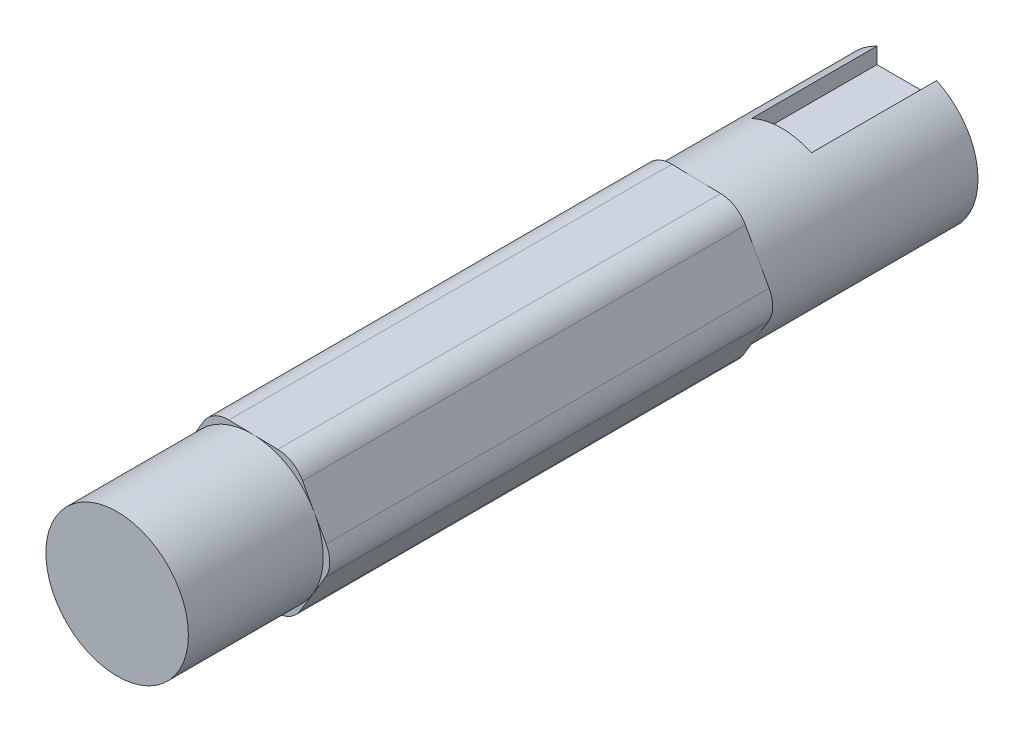
ISO-10303-21;
HEADER;
FILE_DESCRIPTION(('STEP AP214'),'2;1');
FILE_NAME('part.step','',(''),(''),'','','');
FILE_SCHEMA(('AUTOMOTIVE_DESIGN { 1 0 10303 214 1 1 1 1 }'));
ENDSEC;
DATA;
#1=APPLICATION_CONTEXT('core data for automotive mechanical design processes');
#2=APPLICATION_PROTOCOL_DEFINITION('international standard','automotive_design',2000,#1);
#3=PRODUCT_CONTEXT('',#1,'mechanical');
#4=PRODUCT('Part','Part','',(#3));
#5=PRODUCT_RELATED_PRODUCT_CATEGORY('part','',(#4));
#6=PRODUCT_DEFINITION_FORMATION('','',#4);
#7=PRODUCT_DEFINITION_CONTEXT('part definition',#1,'design');
#8=PRODUCT_DEFINITION('design','',#6,#7);
#9=PRODUCT_DEFINITION_SHAPE('','',#8);
#10=(LENGTH_UNIT() NAMED_UNIT(*) SI_UNIT(.MILLI.,.METRE.));
#11=(NAMED_UNIT(*) PLANE_ANGLE_UNIT() SI_UNIT($,.RADIAN.));
#12=(NAMED_UNIT(*) SI_UNIT($,.STERADIAN.) SOLID_ANGLE_UNIT());
#13=UNCERTAINTY_MEASURE_WITH_UNIT(LENGTH_MEASURE(1.E-05),#10,'distance_accuracy_value','');
#14=(GEOMETRIC_REPRESENTATION_CONTEXT(3) GLOBAL_UNCERTAINTY_ASSIGNED_CONTEXT((#13)) GLOBAL_UNIT_ASSIGNED_CONTEXT((#10,
#11,#12)) REPRESENTATION_CONTEXT('',''));
#15=CARTESIAN_POINT('',(0.,0.,0.));
#16=DIRECTION('',(0.,0.,1.));
#17=DIRECTION('',(1.,0.,0.));
#18=AXIS2_PLACEMENT_3D('',#15,#16,#17);
#19=CARTESIAN_POINT('',(0.,0.,-45.));
#20=DIRECTION('',(0.,0.,1.));
#21=DIRECTION('',(1.,0.,0.));
#22=AXIS2_PLACEMENT_3D('',#19,#20,#21);
#23=CYLINDRICAL_SURFACE('',#22,7.4);
#24=DIRECTION('',(0.,0.,1.));
#25=VECTOR('',#24,1.);
#26=CARTESIAN_POINT('',(3.1,6.71937497093294,-45.));
#27=LINE('',#26,#25);
#28=CARTESIAN_POINT('',(3.1,6.71937497093294,-32.));
#29=VERTEX_POINT('',#28);
#30=CARTESIAN_POINT('',(3.1,6.71937497093294,-45.));
#31=VERTEX_POINT('',#30);
#32=EDGE_CURVE('E268',#29,#31,#27,.F.);
#33=ORIENTED_EDGE('',*,*,#32,.F.);
#34=CARTESIAN_POINT('',(0.,0.,-32.));
#35=DIRECTION('',(0.,0.,-1.));
#36=DIRECTION('',(-1.,0.,0.));
#37=AXIS2_PLACEMENT_3D('',#34,#35,#36);
#38=CIRCLE('',#37,7.4);
#39=CARTESIAN_POINT('',(-3.1,6.71937497093294,-32.));
#40=VERTEX_POINT('',#39);
#41=EDGE_CURVE('E228',#29,#40,#38,.F.);
#42=ORIENTED_EDGE('',*,*,#41,.T.);
#43=DIRECTION('',(0.,0.,1.));
#44=VECTOR('',#43,1.);
#45=CARTESIAN_POINT('',(-3.1,6.71937497093294,-45.));
#46=LINE('',#45,#44);
#47=CARTESIAN_POINT('',(-3.1,6.71937497093294,-45.));
#48=VERTEX_POINT('',#47);
#49=EDGE_CURVE('E263',#48,#40,#46,.T.);
#50=ORIENTED_EDGE('',*,*,#49,.F.);
#51=CARTESIAN_POINT('',(0.,0.,-45.));
#52=DIRECTION('',(0.,0.,1.));
#53=DIRECTION('',(1.,0.,0.));
#54=AXIS2_PLACEMENT_3D('',#51,#52,#53);
#55=CIRCLE('',#54,7.4);
#56=EDGE_CURVE('E275',#48,#31,#55,.T.);
#57=ORIENTED_EDGE('',*,*,#56,.T.);
#58=EDGE_LOOP('',(#33,#42,#50,#57));
#59=FACE_BOUND('',#58,.T.);
#60=CARTESIAN_POINT('',(0.,0.,-23.));
#61=DIRECTION('',(0.,0.,1.));
#62=DIRECTION('',(1.,0.,0.));
#63=AXIS2_PLACEMENT_3D('',#60,#61,#62);
#64=CIRCLE('',#63,7.4);
#65=CARTESIAN_POINT('',(6.48141034826039,3.57089903210146,-23.));
#66=VERTEX_POINT('',#65);
#67=CARTESIAN_POINT('',(6.33319445027932,-3.82761649789412,-23.));
#68=VERTEX_POINT('',#67);
#69=EDGE_CURVE('E218',#66,#68,#64,.F.);
#70=ORIENTED_EDGE('',*,*,#69,.T.);
#71=CARTESIAN_POINT('',(-0.148215897981072,-7.39851552999558,-23.));
#72=VERTEX_POINT('',#71);
#73=EDGE_CURVE('E290',#68,#72,#64,.F.);
#74=ORIENTED_EDGE('',*,*,#73,.T.);
#75=CARTESIAN_POINT('',(-6.48141034826039,-3.57089903210145,-23.));
#76=VERTEX_POINT('',#75);
#77=EDGE_CURVE('E361',#72,#76,#64,.F.);
#78=ORIENTED_EDGE('',*,*,#77,.T.);
#79=CARTESIAN_POINT('',(-6.33319445027932,3.82761649789412,-23.));
#80=VERTEX_POINT('',#79);
#81=EDGE_CURVE('E364',#76,#80,#64,.F.);
#82=ORIENTED_EDGE('',*,*,#81,.T.);
#83=CARTESIAN_POINT('',(0.148215897981073,7.39851552999557,-23.));
#84=VERTEX_POINT('',#83);
#85=EDGE_CURVE('E367',#80,#84,#64,.F.);
#86=ORIENTED_EDGE('',*,*,#85,.T.);
#87=EDGE_CURVE('E289',#84,#66,#64,.F.);
#88=ORIENTED_EDGE('',*,*,#87,.T.);
#89=EDGE_LOOP('',(#70,#74,#78,#82,#86,#88));
#90=FACE_BOUND('',#89,.T.);
#91=ADVANCED_FACE('F39',(#59,#90),#23,.T.);
#92=CARTESIAN_POINT('',(0.,0.,-45.));
#93=DIRECTION('',(0.,0.,1.));
#94=DIRECTION('',(1.,0.,0.));
#95=AXIS2_PLACEMENT_3D('',#92,#93,#94);
#96=PLANE('',#95);
#97=DIRECTION('',(-1.,0.,0.));
#98=VECTOR('',#97,1.);
#99=CARTESIAN_POINT('',(3.1,5.05,-45.));
#100=LINE('',#99,#98);
#101=CARTESIAN_POINT('',(3.1,5.05,-45.));
#102=VERTEX_POINT('',#101);
#103=CARTESIAN_POINT('',(-3.1,5.05,-45.));
#104=VERTEX_POINT('',#103);
#105=EDGE_CURVE('E253',#102,#104,#100,.T.);
#106=ORIENTED_EDGE('',*,*,#105,.F.);
#107=DIRECTION('',(0.,1.,0.));
#108=VECTOR('',#107,1.);
#109=CARTESIAN_POINT('',(3.1,0.,-45.));
#110=LINE('',#109,#108);
#111=EDGE_CURVE('E279',#102,#31,#110,.T.);
#112=ORIENTED_EDGE('',*,*,#111,.T.);
#113=ORIENTED_EDGE('',*,*,#56,.F.);
#114=DIRECTION('',(0.,1.,0.));
#115=VECTOR('',#114,1.);
#116=CARTESIAN_POINT('',(-3.1,9.75,-45.));
#117=LINE('',#116,#115);
#118=EDGE_CURVE('E244',#104,#48,#117,.T.);
#119=ORIENTED_EDGE('',*,*,#118,.F.);
#120=EDGE_LOOP('',(#106,#112,#113,#119));
#121=FACE_BOUND('',#120,.T.);
#122=ADVANCED_FACE('F515',(#121),#96,.F.);
#123=CARTESIAN_POINT('',(3.1,9.75,-32.));
#124=DIRECTION('',(1.,0.,0.));
#125=DIRECTION('',(0.,0.,-1.));
#126=AXIS2_PLACEMENT_3D('',#123,#124,#125);
#127=PLANE('',#126);
#128=ORIENTED_EDGE('',*,*,#32,.T.);
#129=ORIENTED_EDGE('',*,*,#111,.F.);
#130=DIRECTION('',(0.,0.,-1.));
#131=VECTOR('',#130,1.);
#132=CARTESIAN_POINT('',(3.1,5.05,-32.));
#133=LINE('',#132,#131);
#134=CARTESIAN_POINT('',(3.1,5.05,-32.));
#135=VERTEX_POINT('',#134);
#136=EDGE_CURVE('E252',#135,#102,#133,.T.);
#137=ORIENTED_EDGE('',*,*,#136,.F.);
#138=DIRECTION('',(0.,-1.,0.));
#139=VECTOR('',#138,1.);
#140=CARTESIAN_POINT('',(3.1,9.75,-32.));
#141=LINE('',#140,#139);
#142=EDGE_CURVE('E240',#29,#135,#141,.T.);
#143=ORIENTED_EDGE('',*,*,#142,.F.);
#144=EDGE_LOOP('',(#128,#129,#137,#143));
#145=FACE_BOUND('',#144,.T.);
#146=ADVANCED_FACE('F521',(#145),#127,.F.);
#147=CARTESIAN_POINT('',(-3.1,9.75,-32.));
#148=DIRECTION('',(-1.,0.,0.));
#149=DIRECTION('',(0.,0.,1.));
#150=AXIS2_PLACEMENT_3D('',#147,#148,#149);
#151=PLANE('',#150);
#152=ORIENTED_EDGE('',*,*,#49,.T.);
#153=DIRECTION('',(0.,1.,0.));
#154=VECTOR('',#153,1.);
#155=CARTESIAN_POINT('',(-3.1,9.75,-32.));
#156=LINE('',#155,#154);
#157=CARTESIAN_POINT('',(-3.1,5.05,-32.));
#158=VERTEX_POINT('',#157);
#159=EDGE_CURVE('E248',#158,#40,#156,.T.);
#160=ORIENTED_EDGE('',*,*,#159,.F.);
#161=DIRECTION('',(0.,0.,-1.));
#162=VECTOR('',#161,1.);
#163=CARTESIAN_POINT('',(-3.1,5.05,-32.));
#164=LINE('',#163,#162);
#165=EDGE_CURVE('E260',#158,#104,#164,.T.);
#166=ORIENTED_EDGE('',*,*,#165,.T.);
#167=ORIENTED_EDGE('',*,*,#118,.T.);
#168=EDGE_LOOP('',(#152,#160,#166,#167));
#169=FACE_BOUND('',#168,.T.);
#170=ADVANCED_FACE('F540',(#169),#151,.F.);
#171=CARTESIAN_POINT('',(3.1,5.05,-32.));
#172=DIRECTION('',(0.,-1.,0.));
#173=DIRECTION('',(0.,0.,-1.));
#174=AXIS2_PLACEMENT_3D('',#171,#172,#173);
#175=PLANE('',#174);
#176=ORIENTED_EDGE('',*,*,#105,.T.);
#177=ORIENTED_EDGE('',*,*,#165,.F.);
#178=DIRECTION('',(-1.,0.,0.));
#179=VECTOR('',#178,1.);
#180=CARTESIAN_POINT('',(3.1,5.05,-32.));
#181=LINE('',#180,#179);
#182=EDGE_CURVE('E243',#135,#158,#181,.T.);
#183=ORIENTED_EDGE('',*,*,#182,.F.);
#184=ORIENTED_EDGE('',*,*,#136,.T.);
#185=EDGE_LOOP('',(#176,#177,#183,#184));
#186=FACE_BOUND('',#185,.T.);
#187=ADVANCED_FACE('F542',(#186),#175,.F.);
#188=CARTESIAN_POINT('',(0.,0.,-32.));
#189=DIRECTION('',(0.,0.,-1.));
#190=DIRECTION('',(-1.,0.,0.));
#191=AXIS2_PLACEMENT_3D('',#188,#189,#190);
#192=PLANE('',#191);
#193=ORIENTED_EDGE('',*,*,#142,.T.);
#194=ORIENTED_EDGE('',*,*,#182,.T.);
#195=ORIENTED_EDGE('',*,*,#159,.T.);
#196=ORIENTED_EDGE('',*,*,#41,.F.);
#197=EDGE_LOOP('',(#193,#194,#195,#196));
#198=FACE_BOUND('',#197,.T.);
#199=ADVANCED_FACE('F545',(#198),#192,.T.);
#200=CARTESIAN_POINT('',(8.54306986569314,-0.171144977195107,45.715247407868));
#201=DIRECTION('',(-0.875866263278431,-0.482553923256953,0.));
#202=DIRECTION('',(0.482553923256953,-0.875866263278431,0.));
#203=AXIS2_PLACEMENT_3D('',#200,#201,#202);
#204=PLANE('',#203);
#205=DIRECTION('',(-0.482553923256953,0.875866263278431,0.));
#206=VECTOR('',#205,1.);
#207=CARTESIAN_POINT('',(8.54306986569314,-0.171144977195107,23.));
#208=LINE('',#207,#206);
#209=CARTESIAN_POINT('',(7.70726195322041,1.34589989143863,23.));
#210=VERTEX_POINT('',#209);
#211=CARTESIAN_POINT('',(6.48141034826039,3.57089903210146,23.));
#212=VERTEX_POINT('',#211);
#213=EDGE_CURVE('E225',#210,#212,#208,.T.);
#214=ORIENTED_EDGE('',*,*,#213,.F.);
#215=DIRECTION('',(0.,0.,-1.));
#216=VECTOR('',#215,1.);
#217=CARTESIAN_POINT('',(7.70726195322041,1.34589989143863,45.715247407868));
#218=LINE('',#217,#216);
#219=CARTESIAN_POINT('',(7.70726195322041,1.34589989143863,-23.));
#220=VERTEX_POINT('',#219);
#221=EDGE_CURVE('E350',#210,#220,#218,.T.);
#222=ORIENTED_EDGE('',*,*,#221,.T.);
#223=DIRECTION('',(-0.482553923256953,0.875866263278431,0.));
#224=VECTOR('',#223,1.);
#225=CARTESIAN_POINT('',(8.54306986569314,-0.171144977195107,-23.));
#226=LINE('',#225,#224);
#227=EDGE_CURVE('E429',#220,#66,#226,.T.);
#228=ORIENTED_EDGE('',*,*,#227,.T.);
#229=CARTESIAN_POINT('',(5.25555874330038,5.79589817276428,-23.));
#230=VERTEX_POINT('',#229);
#231=EDGE_CURVE('E433',#66,#230,#226,.T.);
#232=ORIENTED_EDGE('',*,*,#231,.T.);
#233=DIRECTION('',(0.,0.,-1.));
#234=VECTOR('',#233,1.);
#235=CARTESIAN_POINT('',(5.25555874330038,5.79589817276428,45.715247407868));
#236=LINE('',#235,#234);
#237=CARTESIAN_POINT('',(5.25555874330038,5.79589817276428,23.));
#238=VERTEX_POINT('',#237);
#239=EDGE_CURVE('E347',#230,#238,#236,.F.);
#240=ORIENTED_EDGE('',*,*,#239,.T.);
#241=EDGE_CURVE('E202',#212,#238,#208,.T.);
#242=ORIENTED_EDGE('',*,*,#241,.F.);
#243=EDGE_LOOP('',(#214,#222,#228,#232,#240,#242));
#244=FACE_BOUND('',#243,.T.);
#245=ADVANCED_FACE('F437',(#244),#204,.F.);
#246=CARTESIAN_POINT('',(4.41975083082764,7.31294304139802,45.715247407868));
#247=DIRECTION('',(-0.0200291754028477,-0.999799395945348,0.));
#248=DIRECTION('',(0.999799395945348,-0.0200291754028477,0.));
#249=AXIS2_PLACEMENT_3D('',#246,#247,#248);
#250=PLANE('',#249);
#251=DIRECTION('',(-0.999799395945348,0.0200291754028477,0.));
#252=VECTOR('',#251,1.);
#253=CARTESIAN_POINT('',(4.41975083082764,7.31294304139802,-23.));
#254=LINE('',#253,#252);
#255=CARTESIAN_POINT('',(-2.39161568371148,7.44939646916169,-23.));
#256=VERTEX_POINT('',#255);
#257=EDGE_CURVE('E422',#84,#256,#254,.T.);
#258=ORIENTED_EDGE('',*,*,#257,.T.);
#259=DIRECTION('',(0.,0.,-1.));
#260=VECTOR('',#259,1.);
#261=CARTESIAN_POINT('',(-2.39161568371148,7.44939646916169,45.715247407868));
#262=LINE('',#261,#260);
#263=CARTESIAN_POINT('',(-2.39161568371148,7.44939646916169,23.));
#264=VERTEX_POINT('',#263);
#265=EDGE_CURVE('E305',#256,#264,#262,.F.);
#266=ORIENTED_EDGE('',*,*,#265,.T.);
#267=DIRECTION('',(-0.999799395945348,0.0200291754028477,0.));
#268=VECTOR('',#267,1.);
#269=CARTESIAN_POINT('',(4.41975083082764,7.31294304139802,23.));
#270=LINE('',#269,#268);
#271=CARTESIAN_POINT('',(0.148215897981073,7.39851552999557,23.));
#272=VERTEX_POINT('',#271);
#273=EDGE_CURVE('E398',#272,#264,#270,.T.);
#274=ORIENTED_EDGE('',*,*,#273,.F.);
#275=CARTESIAN_POINT('',(2.68804747967363,7.34763459082946,23.));
#276=VERTEX_POINT('',#275);
#277=EDGE_CURVE('E396',#276,#272,#270,.T.);
#278=ORIENTED_EDGE('',*,*,#277,.F.);
#279=DIRECTION('',(0.,0.,-1.));
#280=VECTOR('',#279,1.);
#281=CARTESIAN_POINT('',(2.68804747967363,7.34763459082946,45.715247407868));
#282=LINE('',#281,#280);
#283=CARTESIAN_POINT('',(2.68804747967363,7.34763459082946,-23.));
#284=VERTEX_POINT('',#283);
#285=EDGE_CURVE('E301',#276,#284,#282,.T.);
#286=ORIENTED_EDGE('',*,*,#285,.T.);
#287=EDGE_CURVE('E415',#284,#84,#254,.T.);
#288=ORIENTED_EDGE('',*,*,#287,.T.);
#289=EDGE_LOOP('',(#258,#266,#274,#278,#286,#288));
#290=FACE_BOUND('',#289,.T.);
#291=ADVANCED_FACE('F414',(#290),#250,.F.);
#292=CARTESIAN_POINT('',(-4.1233190348655,7.48408801859313,45.715247407868));
#293=DIRECTION('',(0.855837087875584,-0.517245472688394,0.));
#294=DIRECTION('',(0.517245472688394,0.855837087875584,0.));
#295=AXIS2_PLACEMENT_3D('',#292,#293,#294);
#296=PLANE('',#295);
#297=DIRECTION('',(-0.517245472688394,-0.855837087875584,0.));
#298=VECTOR('',#297,1.);
#299=CARTESIAN_POINT('',(-4.1233190348655,7.48408801859313,23.));
#300=LINE('',#299,#298);
#301=CARTESIAN_POINT('',(-5.01921447354678,6.00173469939082,23.));
#302=VERTEX_POINT('',#301);
#303=CARTESIAN_POINT('',(-6.33319445027932,3.82761649789412,23.));
#304=VERTEX_POINT('',#303);
#305=EDGE_CURVE('E390',#302,#304,#300,.T.);
#306=ORIENTED_EDGE('',*,*,#305,.F.);
#307=DIRECTION('',(0.,0.,-1.));
#308=VECTOR('',#307,1.);
#309=CARTESIAN_POINT('',(-5.01921447354678,6.00173469939083,45.715247407868));
#310=LINE('',#309,#308);
#311=CARTESIAN_POINT('',(-5.01921447354678,6.00173469939083,-23.));
#312=VERTEX_POINT('',#311);
#313=EDGE_CURVE('E294',#302,#312,#310,.T.);
#314=ORIENTED_EDGE('',*,*,#313,.T.);
#315=DIRECTION('',(-0.517245472688394,-0.855837087875584,0.));
#316=VECTOR('',#315,1.);
#317=CARTESIAN_POINT('',(-4.1233190348655,7.48408801859313,-23.));
#318=LINE('',#317,#316);
#319=EDGE_CURVE('E427',#312,#80,#318,.T.);
#320=ORIENTED_EDGE('',*,*,#319,.T.);
#321=CARTESIAN_POINT('',(-7.64717442701186,1.65349829639741,-23.));
#322=VERTEX_POINT('',#321);
#323=EDGE_CURVE('E421',#80,#322,#318,.T.);
#324=ORIENTED_EDGE('',*,*,#323,.T.);
#325=DIRECTION('',(0.,0.,-1.));
#326=VECTOR('',#325,1.);
#327=CARTESIAN_POINT('',(-7.64717442701186,1.65349829639741,45.715247407868));
#328=LINE('',#327,#326);
#329=CARTESIAN_POINT('',(-7.64717442701186,1.65349829639741,23.));
#330=VERTEX_POINT('',#329);
#331=EDGE_CURVE('E291',#322,#330,#328,.F.);
#332=ORIENTED_EDGE('',*,*,#331,.T.);
#333=EDGE_CURVE('E392',#304,#330,#300,.T.);
#334=ORIENTED_EDGE('',*,*,#333,.F.);
#335=EDGE_LOOP('',(#306,#314,#320,#324,#332,#334));
#336=FACE_BOUND('',#335,.T.);
#337=ADVANCED_FACE('F452',(#336),#296,.F.);
#338=CARTESIAN_POINT('',(-8.54306986569314,0.171144977195107,45.715247407868));
#339=DIRECTION('',(0.875866263278431,0.482553923256953,0.));
#340=DIRECTION('',(-0.482553923256954,0.875866263278431,0.));
#341=AXIS2_PLACEMENT_3D('',#338,#339,#340);
#342=PLANE('',#341);
#343=DIRECTION('',(0.482553923256954,-0.875866263278431,0.));
#344=VECTOR('',#343,1.);
#345=CARTESIAN_POINT('',(-8.54306986569314,0.171144977195107,23.));
#346=LINE('',#345,#344);
#347=CARTESIAN_POINT('',(-7.7072619532204,-1.34589989143864,23.));
#348=VERTEX_POINT('',#347);
#349=CARTESIAN_POINT('',(-6.48141034826039,-3.57089903210146,23.));
#350=VERTEX_POINT('',#349);
#351=EDGE_CURVE('E384',#348,#350,#346,.T.);
#352=ORIENTED_EDGE('',*,*,#351,.F.);
#353=DIRECTION('',(0.,0.,-1.));
#354=VECTOR('',#353,1.);
#355=CARTESIAN_POINT('',(-7.7072619532204,-1.34589989143863,45.715247407868));
#356=LINE('',#355,#354);
#357=CARTESIAN_POINT('',(-7.7072619532204,-1.34589989143863,-23.));
#358=VERTEX_POINT('',#357);
#359=EDGE_CURVE('E314',#348,#358,#356,.T.);
#360=ORIENTED_EDGE('',*,*,#359,.T.);
#361=DIRECTION('',(0.482553923256953,-0.875866263278431,0.));
#362=VECTOR('',#361,1.);
#363=CARTESIAN_POINT('',(-8.54306986569314,0.171144977195107,-23.));
#364=LINE('',#363,#362);
#365=EDGE_CURVE('E487',#358,#76,#364,.T.);
#366=ORIENTED_EDGE('',*,*,#365,.T.);
#367=CARTESIAN_POINT('',(-5.25555874330038,-5.79589817276428,-23.));
#368=VERTEX_POINT('',#367);
#369=EDGE_CURVE('E489',#76,#368,#364,.T.);
#370=ORIENTED_EDGE('',*,*,#369,.T.);
#371=DIRECTION('',(0.,0.,-1.));
#372=VECTOR('',#371,1.);
#373=CARTESIAN_POINT('',(-5.25555874330038,-5.79589817276428,45.715247407868));
#374=LINE('',#373,#372);
#375=CARTESIAN_POINT('',(-5.25555874330037,-5.79589817276428,23.));
#376=VERTEX_POINT('',#375);
#377=EDGE_CURVE('E311',#368,#376,#374,.F.);
#378=ORIENTED_EDGE('',*,*,#377,.T.);
#379=EDGE_CURVE('E386',#350,#376,#346,.T.);
#380=ORIENTED_EDGE('',*,*,#379,.F.);
#381=EDGE_LOOP('',(#352,#360,#366,#370,#378,#380));
#382=FACE_BOUND('',#381,.T.);
#383=ADVANCED_FACE('F463',(#382),#342,.F.);
#384=CARTESIAN_POINT('',(-4.41975083082764,-7.31294304139802,45.715247407868));
#385=DIRECTION('',(0.0200291754028476,0.999799395945348,0.));
#386=DIRECTION('',(-0.999799395945348,0.0200291754028476,0.));
#387=AXIS2_PLACEMENT_3D('',#384,#385,#386);
#388=PLANE('',#387);
#389=DIRECTION('',(0.999799395945348,-0.0200291754028476,0.));
#390=VECTOR('',#389,1.);
#391=CARTESIAN_POINT('',(-4.41975083082764,-7.31294304139802,23.));
#392=LINE('',#391,#390);
#393=CARTESIAN_POINT('',(-2.68804747967363,-7.34763459082946,23.));
#394=VERTEX_POINT('',#393);
#395=CARTESIAN_POINT('',(-0.148215897981072,-7.39851552999557,23.));
#396=VERTEX_POINT('',#395);
#397=EDGE_CURVE('E257',#394,#396,#392,.T.);
#398=ORIENTED_EDGE('',*,*,#397,.F.);
#399=DIRECTION('',(0.,0.,-1.));
#400=VECTOR('',#399,1.);
#401=CARTESIAN_POINT('',(-2.68804747967363,-7.34763459082946,45.715247407868));
#402=LINE('',#401,#400);
#403=CARTESIAN_POINT('',(-2.68804747967363,-7.34763459082946,-23.));
#404=VERTEX_POINT('',#403);
#405=EDGE_CURVE('E327',#394,#404,#402,.T.);
#406=ORIENTED_EDGE('',*,*,#405,.T.);
#407=DIRECTION('',(0.999799395945348,-0.0200291754028476,0.));
#408=VECTOR('',#407,1.);
#409=CARTESIAN_POINT('',(-4.41975083082764,-7.31294304139802,-23.));
#410=LINE('',#409,#408);
#411=EDGE_CURVE('E477',#404,#72,#410,.T.);
#412=ORIENTED_EDGE('',*,*,#411,.T.);
#413=CARTESIAN_POINT('',(2.39161568371149,-7.44939646916169,-23.));
#414=VERTEX_POINT('',#413);
#415=EDGE_CURVE('E483',#72,#414,#410,.T.);
#416=ORIENTED_EDGE('',*,*,#415,.T.);
#417=DIRECTION('',(0.,0.,-1.));
#418=VECTOR('',#417,1.);
#419=CARTESIAN_POINT('',(2.39161568371148,-7.44939646916169,45.715247407868));
#420=LINE('',#419,#418);
#421=CARTESIAN_POINT('',(2.39161568371148,-7.44939646916169,23.));
#422=VERTEX_POINT('',#421);
#423=EDGE_CURVE('E324',#414,#422,#420,.F.);
#424=ORIENTED_EDGE('',*,*,#423,.T.);
#425=EDGE_CURVE('E381',#396,#422,#392,.T.);
#426=ORIENTED_EDGE('',*,*,#425,.F.);
#427=EDGE_LOOP('',(#398,#406,#412,#416,#424,#426));
#428=FACE_BOUND('',#427,.T.);
#429=ADVANCED_FACE('F475',(#428),#388,.F.);
#430=CARTESIAN_POINT('',(4.1233190348655,-7.48408801859313,45.715247407868));
#431=DIRECTION('',(-0.855837087875584,0.517245472688394,0.));
#432=DIRECTION('',(-0.517245472688394,-0.855837087875584,0.));
#433=AXIS2_PLACEMENT_3D('',#430,#431,#432);
#434=PLANE('',#433);
#435=DIRECTION('',(0.517245472688394,0.855837087875584,0.));
#436=VECTOR('',#435,1.);
#437=CARTESIAN_POINT('',(4.1233190348655,-7.48408801859313,23.));
#438=LINE('',#437,#436);
#439=CARTESIAN_POINT('',(5.01921447354678,-6.00173469939082,23.));
#440=VERTEX_POINT('',#439);
#441=CARTESIAN_POINT('',(6.33319445027932,-3.82761649789412,23.));
#442=VERTEX_POINT('',#441);
#443=EDGE_CURVE('E189',#440,#442,#438,.T.);
#444=ORIENTED_EDGE('',*,*,#443,.F.);
#445=DIRECTION('',(0.,0.,-1.));
#446=VECTOR('',#445,1.);
#447=CARTESIAN_POINT('',(5.01921447354678,-6.00173469939083,45.715247407868));
#448=LINE('',#447,#446);
#449=CARTESIAN_POINT('',(5.01921447354678,-6.00173469939083,-23.));
#450=VERTEX_POINT('',#449);
#451=EDGE_CURVE('E339',#440,#450,#448,.T.);
#452=ORIENTED_EDGE('',*,*,#451,.T.);
#453=DIRECTION('',(0.517245472688394,0.855837087875584,0.));
#454=VECTOR('',#453,1.);
#455=CARTESIAN_POINT('',(4.1233190348655,-7.48408801859313,-23.));
#456=LINE('',#455,#454);
#457=EDGE_CURVE('E233',#450,#68,#456,.T.);
#458=ORIENTED_EDGE('',*,*,#457,.T.);
#459=CARTESIAN_POINT('',(7.64717442701186,-1.65349829639741,-23.));
#460=VERTEX_POINT('',#459);
#461=EDGE_CURVE('E235',#68,#460,#456,.T.);
#462=ORIENTED_EDGE('',*,*,#461,.T.);
#463=DIRECTION('',(0.,0.,-1.));
#464=VECTOR('',#463,1.);
#465=CARTESIAN_POINT('',(7.64717442701186,-1.65349829639741,45.715247407868));
#466=LINE('',#465,#464);
#467=CARTESIAN_POINT('',(7.64717442701186,-1.65349829639741,23.));
#468=VERTEX_POINT('',#467);
#469=EDGE_CURVE('E231',#460,#468,#466,.F.);
#470=ORIENTED_EDGE('',*,*,#469,.T.);
#471=EDGE_CURVE('E203',#442,#468,#438,.T.);
#472=ORIENTED_EDGE('',*,*,#471,.F.);
#473=EDGE_LOOP('',(#444,#452,#458,#462,#470,#472));
#474=FACE_BOUND('',#473,.T.);
#475=ADVANCED_FACE('F229',(#474),#434,.F.);
#476=CARTESIAN_POINT('',(0.,0.,-23.));
#477=DIRECTION('',(0.,0.,1.));
#478=DIRECTION('',(1.,0.,0.));
#479=AXIS2_PLACEMENT_3D('',#476,#477,#478);
#480=PLANE('',#479);
#481=ORIENTED_EDGE('',*,*,#457,.F.);
#482=CARTESIAN_POINT('',(2.45170320992003,-4.44999828132564,-23.));
#483=DIRECTION('',(0.,0.,1.));
#484=DIRECTION('',(1.,0.,0.));
#485=AXIS2_PLACEMENT_3D('',#482,#483,#484);
#486=CIRCLE('',#485,3.);
#487=EDGE_CURVE('E342',#450,#414,#486,.F.);
#488=ORIENTED_EDGE('',*,*,#487,.T.);
#489=ORIENTED_EDGE('',*,*,#415,.F.);
#490=ORIENTED_EDGE('',*,*,#73,.F.);
#491=EDGE_LOOP('',(#481,#488,#489,#490));
#492=FACE_BOUND('',#491,.T.);
#493=ADVANCED_FACE('F495',(#492),#480,.F.);
#494=ORIENTED_EDGE('',*,*,#411,.F.);
#495=CARTESIAN_POINT('',(-2.62795995346508,-4.34823640299342,-23.));
#496=DIRECTION('',(0.,0.,1.));
#497=DIRECTION('',(1.,0.,0.));
#498=AXIS2_PLACEMENT_3D('',#495,#496,#497);
#499=CIRCLE('',#498,3.);
#500=EDGE_CURVE('E331',#404,#368,#499,.F.);
#501=ORIENTED_EDGE('',*,*,#500,.T.);
#502=ORIENTED_EDGE('',*,*,#369,.F.);
#503=ORIENTED_EDGE('',*,*,#77,.F.);
#504=EDGE_LOOP('',(#494,#501,#502,#503));
#505=FACE_BOUND('',#504,.T.);
#506=ADVANCED_FACE('F480',(#505),#480,.F.);
#507=ORIENTED_EDGE('',*,*,#365,.F.);
#508=CARTESIAN_POINT('',(-5.07966316338511,0.101761878332226,-23.));
#509=DIRECTION('',(0.,0.,1.));
#510=DIRECTION('',(1.,0.,0.));
#511=AXIS2_PLACEMENT_3D('',#508,#509,#510);
#512=CIRCLE('',#511,3.);
#513=EDGE_CURVE('E318',#358,#322,#512,.F.);
#514=ORIENTED_EDGE('',*,*,#513,.T.);
#515=ORIENTED_EDGE('',*,*,#323,.F.);
#516=ORIENTED_EDGE('',*,*,#81,.F.);
#517=EDGE_LOOP('',(#507,#514,#515,#516));
#518=FACE_BOUND('',#517,.T.);
#519=ADVANCED_FACE('F447',(#518),#480,.F.);
#520=ORIENTED_EDGE('',*,*,#319,.F.);
#521=CARTESIAN_POINT('',(-2.45170320992003,4.44999828132564,-23.));
#522=DIRECTION('',(0.,0.,1.));
#523=DIRECTION('',(1.,0.,0.));
#524=AXIS2_PLACEMENT_3D('',#521,#522,#523);
#525=CIRCLE('',#524,3.);
#526=EDGE_CURVE('E298',#312,#256,#525,.F.);
#527=ORIENTED_EDGE('',*,*,#526,.T.);
#528=ORIENTED_EDGE('',*,*,#257,.F.);
#529=ORIENTED_EDGE('',*,*,#85,.F.);
#530=EDGE_LOOP('',(#520,#527,#528,#529));
#531=FACE_BOUND('',#530,.T.);
#532=ADVANCED_FACE('F444',(#531),#480,.F.);
#533=ORIENTED_EDGE('',*,*,#287,.F.);
#534=CARTESIAN_POINT('',(2.62795995346509,4.34823640299342,-23.));
#535=DIRECTION('',(0.,0.,1.));
#536=DIRECTION('',(1.,0.,0.));
#537=AXIS2_PLACEMENT_3D('',#534,#535,#536);
#538=CIRCLE('',#537,3.);
#539=EDGE_CURVE('E48',#284,#230,#538,.F.);
#540=ORIENTED_EDGE('',*,*,#539,.T.);
#541=ORIENTED_EDGE('',*,*,#231,.F.);
#542=ORIENTED_EDGE('',*,*,#87,.F.);
#543=EDGE_LOOP('',(#533,#540,#541,#542));
#544=FACE_BOUND('',#543,.T.);
#545=ADVANCED_FACE('F418',(#544),#480,.F.);
#546=CARTESIAN_POINT('',(0.,0.,23.));
#547=DIRECTION('',(0.,0.,1.));
#548=DIRECTION('',(1.,0.,0.));
#549=AXIS2_PLACEMENT_3D('',#546,#547,#548);
#550=PLANE('',#549);
#551=ORIENTED_EDGE('',*,*,#425,.T.);
#552=CARTESIAN_POINT('',(2.45170320992003,-4.44999828132564,23.));
#553=DIRECTION('',(0.,0.,1.));
#554=DIRECTION('',(1.,0.,0.));
#555=AXIS2_PLACEMENT_3D('',#552,#553,#554);
#556=CIRCLE('',#555,3.);
#557=EDGE_CURVE('E196',#422,#440,#556,.T.);
#558=ORIENTED_EDGE('',*,*,#557,.T.);
#559=ORIENTED_EDGE('',*,*,#443,.T.);
#560=CARTESIAN_POINT('',(0.,0.,23.));
#561=DIRECTION('',(0.,0.,1.));
#562=DIRECTION('',(1.,0.,0.));
#563=AXIS2_PLACEMENT_3D('',#560,#561,#562);
#564=CIRCLE('',#563,7.4);
#565=EDGE_CURVE('E193',#442,#396,#564,.F.);
#566=ORIENTED_EDGE('',*,*,#565,.T.);
#567=EDGE_LOOP('',(#551,#558,#559,#566));
#568=FACE_BOUND('',#567,.T.);
#569=ADVANCED_FACE('F192',(#568),#550,.T.);
#570=ORIENTED_EDGE('',*,*,#379,.T.);
#571=CARTESIAN_POINT('',(-2.62795995346508,-4.34823640299342,23.));
#572=DIRECTION('',(0.,0.,1.));
#573=DIRECTION('',(1.,0.,0.));
#574=AXIS2_PLACEMENT_3D('',#571,#572,#573);
#575=CIRCLE('',#574,3.);
#576=EDGE_CURVE('E334',#376,#394,#575,.T.);
#577=ORIENTED_EDGE('',*,*,#576,.T.);
#578=ORIENTED_EDGE('',*,*,#397,.T.);
#579=EDGE_CURVE('E216',#396,#350,#564,.F.);
#580=ORIENTED_EDGE('',*,*,#579,.T.);
#581=EDGE_LOOP('',(#570,#577,#578,#580));
#582=FACE_BOUND('',#581,.T.);
#583=ADVANCED_FACE('F468',(#582),#550,.T.);
#584=ORIENTED_EDGE('',*,*,#333,.T.);
#585=CARTESIAN_POINT('',(-5.07966316338511,0.101761878332226,23.));
#586=DIRECTION('',(0.,0.,1.));
#587=DIRECTION('',(1.,0.,0.));
#588=AXIS2_PLACEMENT_3D('',#585,#586,#587);
#589=CIRCLE('',#588,3.);
#590=EDGE_CURVE('E321',#330,#348,#589,.T.);
#591=ORIENTED_EDGE('',*,*,#590,.T.);
#592=ORIENTED_EDGE('',*,*,#351,.T.);
#593=EDGE_CURVE('E373',#350,#304,#564,.F.);
#594=ORIENTED_EDGE('',*,*,#593,.T.);
#595=EDGE_LOOP('',(#584,#591,#592,#594));
#596=FACE_BOUND('',#595,.T.);
#597=ADVANCED_FACE('F460',(#596),#550,.T.);
#598=ORIENTED_EDGE('',*,*,#273,.T.);
#599=CARTESIAN_POINT('',(-2.45170320992003,4.44999828132564,23.));
#600=DIRECTION('',(0.,0.,1.));
#601=DIRECTION('',(1.,0.,0.));
#602=AXIS2_PLACEMENT_3D('',#599,#600,#601);
#603=CIRCLE('',#602,3.);
#604=EDGE_CURVE('E308',#264,#302,#603,.T.);
#605=ORIENTED_EDGE('',*,*,#604,.T.);
#606=ORIENTED_EDGE('',*,*,#305,.T.);
#607=EDGE_CURVE('E376',#304,#272,#564,.F.);
#608=ORIENTED_EDGE('',*,*,#607,.T.);
#609=EDGE_LOOP('',(#598,#605,#606,#608));
#610=FACE_BOUND('',#609,.T.);
#611=ADVANCED_FACE('F510',(#610),#550,.T.);
#612=ORIENTED_EDGE('',*,*,#241,.T.);
#613=CARTESIAN_POINT('',(2.62795995346509,4.34823640299342,23.));
#614=DIRECTION('',(0.,0.,1.));
#615=DIRECTION('',(1.,0.,0.));
#616=AXIS2_PLACEMENT_3D('',#613,#614,#615);
#617=CIRCLE('',#616,3.);
#618=EDGE_CURVE('E11',#238,#276,#617,.T.);
#619=ORIENTED_EDGE('',*,*,#618,.T.);
#620=ORIENTED_EDGE('',*,*,#277,.T.);
#621=EDGE_CURVE('E227',#272,#212,#564,.F.);
#622=ORIENTED_EDGE('',*,*,#621,.T.);
#623=EDGE_LOOP('',(#612,#619,#620,#622));
#624=FACE_BOUND('',#623,.T.);
#625=ADVANCED_FACE('F406',(#624),#550,.T.);
#626=ORIENTED_EDGE('',*,*,#227,.F.);
#627=CARTESIAN_POINT('',(5.07966316338511,-0.101761878332226,-23.));
#628=DIRECTION('',(0.,0.,1.));
#629=DIRECTION('',(1.,0.,0.));
#630=AXIS2_PLACEMENT_3D('',#627,#628,#629);
#631=CIRCLE('',#630,3.);
#632=EDGE_CURVE('E62',#220,#460,#631,.F.);
#633=ORIENTED_EDGE('',*,*,#632,.T.);
#634=ORIENTED_EDGE('',*,*,#461,.F.);
#635=ORIENTED_EDGE('',*,*,#69,.F.);
#636=EDGE_LOOP('',(#626,#633,#634,#635));
#637=FACE_BOUND('',#636,.T.);
#638=ADVANCED_FACE('F501',(#637),#480,.F.);
#639=ORIENTED_EDGE('',*,*,#471,.T.);
#640=CARTESIAN_POINT('',(5.07966316338511,-0.101761878332226,23.));
#641=DIRECTION('',(0.,0.,1.));
#642=DIRECTION('',(1.,0.,0.));
#643=AXIS2_PLACEMENT_3D('',#640,#641,#642);
#644=CIRCLE('',#643,3.);
#645=EDGE_CURVE('E355',#468,#210,#644,.T.);
#646=ORIENTED_EDGE('',*,*,#645,.T.);
#647=ORIENTED_EDGE('',*,*,#213,.T.);
#648=EDGE_CURVE('E212',#212,#442,#564,.F.);
#649=ORIENTED_EDGE('',*,*,#648,.T.);
#650=EDGE_LOOP('',(#639,#646,#647,#649));
#651=FACE_BOUND('',#650,.T.);
#652=ADVANCED_FACE('F222',(#651),#550,.T.);
#653=CARTESIAN_POINT('',(0.,0.,37.));
#654=DIRECTION('',(0.,0.,1.));
#655=DIRECTION('',(1.,0.,0.));
#656=AXIS2_PLACEMENT_3D('',#653,#654,#655);
#657=PLANE('',#656);
#658=CARTESIAN_POINT('',(0.,0.,37.));
#659=DIRECTION('',(0.,0.,1.));
#660=DIRECTION('',(1.,0.,0.));
#661=AXIS2_PLACEMENT_3D('',#658,#659,#660);
#662=CIRCLE('',#661,7.4);
#663=CARTESIAN_POINT('',(7.4,0.,37.));
#664=VERTEX_POINT('',#663);
#665=EDGE_CURVE('E271',#664,#664,#662,.T.);
#666=ORIENTED_EDGE('',*,*,#665,.T.);
#667=EDGE_LOOP('',(#666));
#668=FACE_BOUND('',#667,.T.);
#669=ADVANCED_FACE('F508',(#668),#657,.T.);
#670=ORIENTED_EDGE('',*,*,#565,.F.);
#671=ORIENTED_EDGE('',*,*,#648,.F.);
#672=ORIENTED_EDGE('',*,*,#621,.F.);
#673=ORIENTED_EDGE('',*,*,#607,.F.);
#674=ORIENTED_EDGE('',*,*,#593,.F.);
#675=ORIENTED_EDGE('',*,*,#579,.F.);
#676=EDGE_LOOP('',(#670,#671,#672,#673,#674,#675));
#677=FACE_BOUND('',#676,.T.);
#678=ORIENTED_EDGE('',*,*,#665,.F.);
#679=EDGE_LOOP('',(#678));
#680=FACE_BOUND('',#679,.T.);
#681=ADVANCED_FACE('F209',(#677,#680),#23,.T.);
#682=CARTESIAN_POINT('',(-2.45170320992003,4.44999828132564,45.715247407868));
#683=DIRECTION('',(0.,0.,-1.));
#684=DIRECTION('',(-1.,0.,0.));
#685=AXIS2_PLACEMENT_3D('',#682,#683,#684);
#686=CYLINDRICAL_SURFACE('',#685,3.);
#687=ORIENTED_EDGE('',*,*,#604,.F.);
#688=ORIENTED_EDGE('',*,*,#265,.F.);
#689=ORIENTED_EDGE('',*,*,#526,.F.);
#690=ORIENTED_EDGE('',*,*,#313,.F.);
#691=EDGE_LOOP('',(#687,#688,#689,#690));
#692=FACE_BOUND('',#691,.T.);
#693=ADVANCED_FACE('F527',(#692),#686,.T.);
#694=CARTESIAN_POINT('',(-5.07966316338511,0.101761878332226,45.715247407868));
#695=DIRECTION('',(0.,0.,-1.));
#696=DIRECTION('',(-1.,0.,0.));
#697=AXIS2_PLACEMENT_3D('',#694,#695,#696);
#698=CYLINDRICAL_SURFACE('',#697,3.);
#699=ORIENTED_EDGE('',*,*,#590,.F.);
#700=ORIENTED_EDGE('',*,*,#331,.F.);
#701=ORIENTED_EDGE('',*,*,#513,.F.);
#702=ORIENTED_EDGE('',*,*,#359,.F.);
#703=EDGE_LOOP('',(#699,#700,#701,#702));
#704=FACE_BOUND('',#703,.T.);
#705=ADVANCED_FACE('F456',(#704),#698,.T.);
#706=CARTESIAN_POINT('',(-2.62795995346508,-4.34823640299342,45.715247407868));
#707=DIRECTION('',(0.,0.,-1.));
#708=DIRECTION('',(-1.,0.,0.));
#709=AXIS2_PLACEMENT_3D('',#706,#707,#708);
#710=CYLINDRICAL_SURFACE('',#709,3.);
#711=ORIENTED_EDGE('',*,*,#576,.F.);
#712=ORIENTED_EDGE('',*,*,#377,.F.);
#713=ORIENTED_EDGE('',*,*,#500,.F.);
#714=ORIENTED_EDGE('',*,*,#405,.F.);
#715=EDGE_LOOP('',(#711,#712,#713,#714));
#716=FACE_BOUND('',#715,.T.);
#717=ADVANCED_FACE('F472',(#716),#710,.T.);
#718=CARTESIAN_POINT('',(2.45170320992003,-4.44999828132564,45.715247407868));
#719=DIRECTION('',(0.,0.,-1.));
#720=DIRECTION('',(-1.,0.,0.));
#721=AXIS2_PLACEMENT_3D('',#718,#719,#720);
#722=CYLINDRICAL_SURFACE('',#721,3.);
#723=ORIENTED_EDGE('',*,*,#557,.F.);
#724=ORIENTED_EDGE('',*,*,#423,.F.);
#725=ORIENTED_EDGE('',*,*,#487,.F.);
#726=ORIENTED_EDGE('',*,*,#451,.F.);
#727=EDGE_LOOP('',(#723,#724,#725,#726));
#728=FACE_BOUND('',#727,.T.);
#729=ADVANCED_FACE('F498',(#728),#722,.T.);
#730=CARTESIAN_POINT('',(5.07966316338511,-0.101761878332226,45.715247407868));
#731=DIRECTION('',(0.,0.,-1.));
#732=DIRECTION('',(-1.,0.,0.));
#733=AXIS2_PLACEMENT_3D('',#730,#731,#732);
#734=CYLINDRICAL_SURFACE('',#733,3.);
#735=ORIENTED_EDGE('',*,*,#645,.F.);
#736=ORIENTED_EDGE('',*,*,#469,.F.);
#737=ORIENTED_EDGE('',*,*,#632,.F.);
#738=ORIENTED_EDGE('',*,*,#221,.F.);
#739=EDGE_LOOP('',(#735,#736,#737,#738));
#740=FACE_BOUND('',#739,.T.);
#741=ADVANCED_FACE('F656',(#740),#734,.T.);
#742=CARTESIAN_POINT('',(2.62795995346509,4.34823640299342,45.715247407868));
#743=DIRECTION('',(0.,0.,-1.));
#744=DIRECTION('',(-1.,0.,0.));
#745=AXIS2_PLACEMENT_3D('',#742,#743,#744);
#746=CYLINDRICAL_SURFACE('',#745,3.);
#747=ORIENTED_EDGE('',*,*,#618,.F.);
#748=ORIENTED_EDGE('',*,*,#239,.F.);
#749=ORIENTED_EDGE('',*,*,#539,.F.);
#750=ORIENTED_EDGE('',*,*,#285,.F.);
#751=EDGE_LOOP('',(#747,#748,#749,#750));
#752=FACE_BOUND('',#751,.T.);
#753=ADVANCED_FACE('F41',(#752),#746,.T.);
#754=CLOSED_SHELL('',(#91,#122,#146,#170,#187,#199,#245,#291,#337,#383,#429,#475,#493,#506,#519,
#532,#545,#569,#583,#597,#611,#625,#638,#652,#669,#681,#693,#705,#717,#729,#741,#753));
#755=MANIFOLD_SOLID_BREP('B2',#754);
#756=ADVANCED_BREP_SHAPE_REPRESENTATION('',(#18,#755),#14);
#757=SHAPE_DEFINITION_REPRESENTATION(#9,#756);
ENDSEC;
END-ISO-10303-21;
